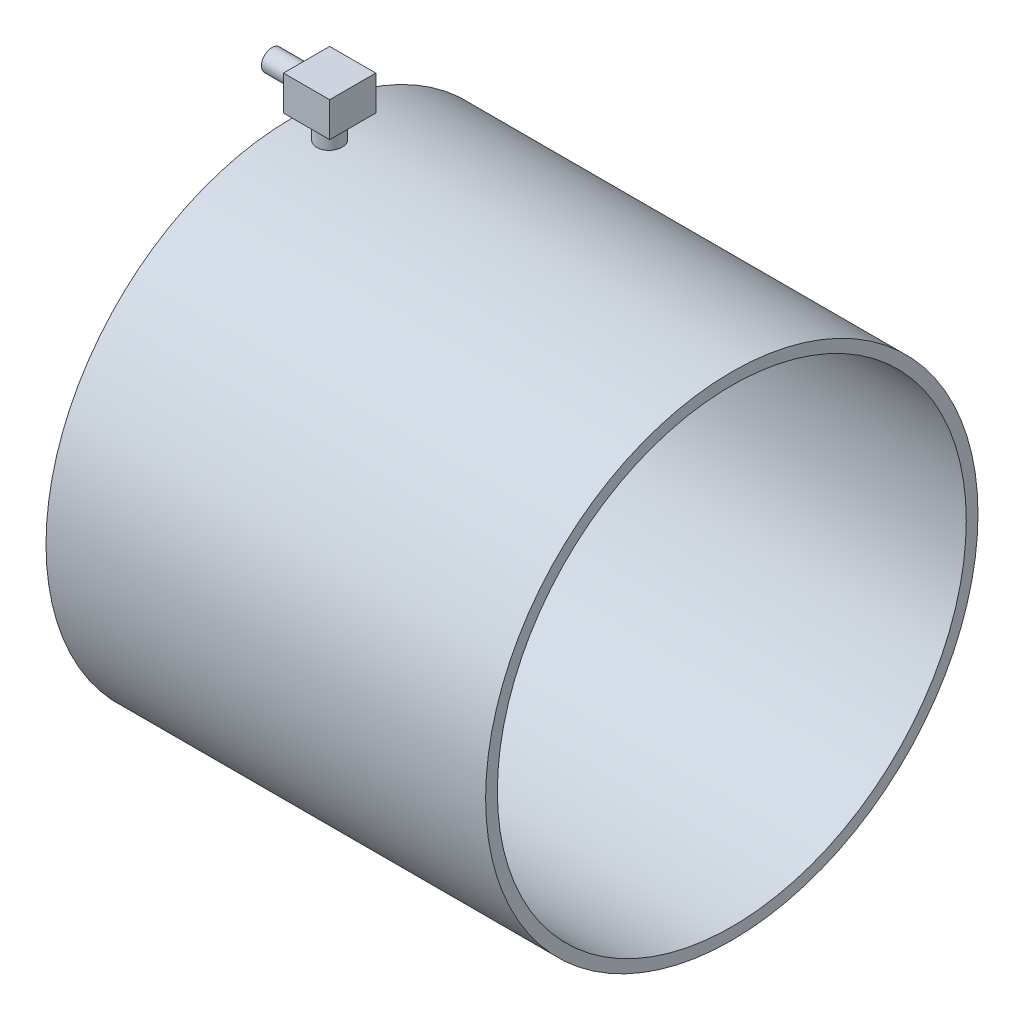
ISO-10303-21;
HEADER;
FILE_DESCRIPTION(('STEP AP214'),'2;1');
FILE_NAME('part.step','',(''),(''),'','','');
FILE_SCHEMA(('AUTOMOTIVE_DESIGN { 1 0 10303 214 1 1 1 1 }'));
ENDSEC;
DATA;
#1=APPLICATION_CONTEXT('core data for automotive mechanical design processes');
#2=APPLICATION_PROTOCOL_DEFINITION('international standard','automotive_design',2000,#1);
#3=PRODUCT_CONTEXT('',#1,'mechanical');
#4=PRODUCT('Part','Part','',(#3));
#5=PRODUCT_RELATED_PRODUCT_CATEGORY('part','',(#4));
#6=PRODUCT_DEFINITION_FORMATION('','',#4);
#7=PRODUCT_DEFINITION_CONTEXT('part definition',#1,'design');
#8=PRODUCT_DEFINITION('design','',#6,#7);
#9=PRODUCT_DEFINITION_SHAPE('','',#8);
#10=(LENGTH_UNIT() NAMED_UNIT(*) SI_UNIT(.MILLI.,.METRE.));
#11=(NAMED_UNIT(*) PLANE_ANGLE_UNIT() SI_UNIT($,.RADIAN.));
#12=(NAMED_UNIT(*) SI_UNIT($,.STERADIAN.) SOLID_ANGLE_UNIT());
#13=UNCERTAINTY_MEASURE_WITH_UNIT(LENGTH_MEASURE(1.E-05),#10,'distance_accuracy_value','');
#14=(GEOMETRIC_REPRESENTATION_CONTEXT(3) GLOBAL_UNCERTAINTY_ASSIGNED_CONTEXT((#13)) GLOBAL_UNIT_ASSIGNED_CONTEXT((#10,
#11,#12)) REPRESENTATION_CONTEXT('',''));
#15=CARTESIAN_POINT('',(0.,0.,0.));
#16=DIRECTION('',(0.,0.,1.));
#17=DIRECTION('',(1.,0.,0.));
#18=AXIS2_PLACEMENT_3D('',#15,#16,#17);
#19=CARTESIAN_POINT('',(3.24493305569254,23.3300961428042,0.));
#20=DIRECTION('',(0.,-1.,0.));
#21=DIRECTION('',(0.,0.,-1.));
#22=AXIS2_PLACEMENT_3D('',#19,#20,#21);
#23=CYLINDRICAL_SURFACE('',#22,1.1044126273876);
#24=CARTESIAN_POINT('',(3.24493305569254,23.3300961428042,0.));
#25=DIRECTION('',(0.,1.,0.));
#26=DIRECTION('',(0.,0.,1.));
#27=AXIS2_PLACEMENT_3D('',#24,#25,#26);
#28=CIRCLE('',#27,1.1044126273876);
#29=CARTESIAN_POINT('',(3.24493305569254,23.3300961428042,1.1044126273876));
#30=VERTEX_POINT('',#29);
#31=EDGE_CURVE('E57',#30,#30,#28,.T.);
#32=ORIENTED_EDGE('',*,*,#31,.F.);
#33=EDGE_LOOP('',(#32));
#34=FACE_BOUND('',#33,.T.);
#35=CARTESIAN_POINT('',(3.24493305569254,20.3300961428042,0.));
#36=DIRECTION('',(0.,1.,0.));
#37=DIRECTION('',(0.,0.,1.));
#38=AXIS2_PLACEMENT_3D('',#35,#36,#37);
#39=CIRCLE('',#38,1.1044126273876);
#40=CARTESIAN_POINT('',(3.24493305569254,20.3300961428042,1.1044126273876));
#41=VERTEX_POINT('',#40);
#42=EDGE_CURVE('E126',#41,#41,#39,.T.);
#43=ORIENTED_EDGE('',*,*,#42,.T.);
#44=EDGE_LOOP('',(#43));
#45=FACE_BOUND('',#44,.T.);
#46=ADVANCED_FACE('F49',(#34,#45),#23,.T.);
#47=CARTESIAN_POINT('',(3.24493305569254,20.3300961428042,0.));
#48=DIRECTION('',(0.,1.,0.));
#49=DIRECTION('',(0.,0.,1.));
#50=AXIS2_PLACEMENT_3D('',#47,#48,#49);
#51=PLANE('',#50);
#52=ORIENTED_EDGE('',*,*,#42,.F.);
#53=EDGE_LOOP('',(#52));
#54=FACE_BOUND('',#53,.T.);
#55=ADVANCED_FACE('F132',(#54),#51,.F.);
#56=CARTESIAN_POINT('',(1.24493305569254,26.3300961428042,-2.));
#57=DIRECTION('',(1.,0.,0.));
#58=DIRECTION('',(0.,0.,-1.));
#59=AXIS2_PLACEMENT_3D('',#56,#57,#58);
#60=PLANE('',#59);
#61=CARTESIAN_POINT('',(1.24493305569254,24.83009614,0.));
#62=DIRECTION('',(1.,0.,0.));
#63=DIRECTION('',(0.,0.,-1.));
#64=AXIS2_PLACEMENT_3D('',#61,#62,#63);
#65=CIRCLE('',#64,0.913347132426428);
#66=CARTESIAN_POINT('',(1.24493305569254,24.83009614,-0.913347132426428));
#67=VERTEX_POINT('',#66);
#68=EDGE_CURVE('E13',#67,#67,#65,.F.);
#69=ORIENTED_EDGE('',*,*,#68,.F.);
#70=EDGE_LOOP('',(#69));
#71=FACE_BOUND('',#70,.T.);
#72=DIRECTION('',(0.,0.,1.));
#73=VECTOR('',#72,1.);
#74=CARTESIAN_POINT('',(1.24493305569254,23.3300961428042,-2.));
#75=LINE('',#74,#73);
#76=CARTESIAN_POINT('',(1.24493305569254,23.3300961428042,-2.));
#77=VERTEX_POINT('',#76);
#78=CARTESIAN_POINT('',(1.24493305569254,23.3300961428042,2.));
#79=VERTEX_POINT('',#78);
#80=EDGE_CURVE('E116',#77,#79,#75,.T.);
#81=ORIENTED_EDGE('',*,*,#80,.T.);
#82=DIRECTION('',(0.,-1.,0.));
#83=VECTOR('',#82,1.);
#84=CARTESIAN_POINT('',(1.24493305569254,26.3300961428042,2.));
#85=LINE('',#84,#83);
#86=CARTESIAN_POINT('',(1.24493305569254,26.3300961428042,2.));
#87=VERTEX_POINT('',#86);
#88=EDGE_CURVE('E107',#87,#79,#85,.T.);
#89=ORIENTED_EDGE('',*,*,#88,.F.);
#90=DIRECTION('',(0.,0.,1.));
#91=VECTOR('',#90,1.);
#92=CARTESIAN_POINT('',(1.24493305569254,26.3300961428042,-2.));
#93=LINE('',#92,#91);
#94=CARTESIAN_POINT('',(1.24493305569254,26.3300961428042,-2.));
#95=VERTEX_POINT('',#94);
#96=EDGE_CURVE('E101',#95,#87,#93,.T.);
#97=ORIENTED_EDGE('',*,*,#96,.F.);
#98=DIRECTION('',(0.,-1.,0.));
#99=VECTOR('',#98,1.);
#100=CARTESIAN_POINT('',(1.24493305569254,26.3300961428042,-2.));
#101=LINE('',#100,#99);
#102=EDGE_CURVE('E112',#95,#77,#101,.T.);
#103=ORIENTED_EDGE('',*,*,#102,.T.);
#104=EDGE_LOOP('',(#81,#89,#97,#103));
#105=FACE_BOUND('',#104,.T.);
#106=ADVANCED_FACE('F134',(#71,#105),#60,.F.);
#107=CARTESIAN_POINT('',(5.24493305569254,26.3300961428042,2.));
#108=DIRECTION('',(0.,0.,-1.));
#109=DIRECTION('',(-1.,0.,0.));
#110=AXIS2_PLACEMENT_3D('',#107,#108,#109);
#111=PLANE('',#110);
#112=DIRECTION('',(1.,0.,0.));
#113=VECTOR('',#112,1.);
#114=CARTESIAN_POINT('',(5.24493305569254,23.3300961428042,2.));
#115=LINE('',#114,#113);
#116=CARTESIAN_POINT('',(5.24493305569254,23.3300961428042,2.));
#117=VERTEX_POINT('',#116);
#118=EDGE_CURVE('E106',#79,#117,#115,.T.);
#119=ORIENTED_EDGE('',*,*,#118,.T.);
#120=DIRECTION('',(0.,-1.,0.));
#121=VECTOR('',#120,1.);
#122=CARTESIAN_POINT('',(5.24493305569254,26.3300961428042,2.));
#123=LINE('',#122,#121);
#124=CARTESIAN_POINT('',(5.24493305569254,26.3300961428042,2.));
#125=VERTEX_POINT('',#124);
#126=EDGE_CURVE('E104',#125,#117,#123,.T.);
#127=ORIENTED_EDGE('',*,*,#126,.F.);
#128=DIRECTION('',(1.,0.,0.));
#129=VECTOR('',#128,1.);
#130=CARTESIAN_POINT('',(5.24493305569254,26.3300961428042,2.));
#131=LINE('',#130,#129);
#132=EDGE_CURVE('E96',#87,#125,#131,.T.);
#133=ORIENTED_EDGE('',*,*,#132,.F.);
#134=ORIENTED_EDGE('',*,*,#88,.T.);
#135=EDGE_LOOP('',(#119,#127,#133,#134));
#136=FACE_BOUND('',#135,.T.);
#137=ADVANCED_FACE('F105',(#136),#111,.F.);
#138=CARTESIAN_POINT('',(5.24493305569254,26.3300961428042,-2.));
#139=DIRECTION('',(-1.,0.,0.));
#140=DIRECTION('',(0.,0.,1.));
#141=AXIS2_PLACEMENT_3D('',#138,#139,#140);
#142=PLANE('',#141);
#143=DIRECTION('',(0.,0.,-1.));
#144=VECTOR('',#143,1.);
#145=CARTESIAN_POINT('',(5.24493305569254,23.3300961428042,-2.));
#146=LINE('',#145,#144);
#147=CARTESIAN_POINT('',(5.24493305569254,23.3300961428042,-2.));
#148=VERTEX_POINT('',#147);
#149=EDGE_CURVE('E82',#117,#148,#146,.T.);
#150=ORIENTED_EDGE('',*,*,#149,.T.);
#151=DIRECTION('',(0.,-1.,0.));
#152=VECTOR('',#151,1.);
#153=CARTESIAN_POINT('',(5.24493305569254,26.3300961428042,-2.));
#154=LINE('',#153,#152);
#155=CARTESIAN_POINT('',(5.24493305569254,26.3300961428042,-2.));
#156=VERTEX_POINT('',#155);
#157=EDGE_CURVE('E108',#156,#148,#154,.T.);
#158=ORIENTED_EDGE('',*,*,#157,.F.);
#159=DIRECTION('',(0.,0.,-1.));
#160=VECTOR('',#159,1.);
#161=CARTESIAN_POINT('',(5.24493305569254,26.3300961428042,-2.));
#162=LINE('',#161,#160);
#163=EDGE_CURVE('E99',#125,#156,#162,.T.);
#164=ORIENTED_EDGE('',*,*,#163,.F.);
#165=ORIENTED_EDGE('',*,*,#126,.T.);
#166=EDGE_LOOP('',(#150,#158,#164,#165));
#167=FACE_BOUND('',#166,.T.);
#168=ADVANCED_FACE('F110',(#167),#142,.F.);
#169=CARTESIAN_POINT('',(5.24493305569254,26.3300961428042,-2.));
#170=DIRECTION('',(0.,0.,1.));
#171=DIRECTION('',(1.,0.,0.));
#172=AXIS2_PLACEMENT_3D('',#169,#170,#171);
#173=PLANE('',#172);
#174=DIRECTION('',(-1.,0.,0.));
#175=VECTOR('',#174,1.);
#176=CARTESIAN_POINT('',(5.24493305569254,23.3300961428042,-2.));
#177=LINE('',#176,#175);
#178=EDGE_CURVE('E88',#148,#77,#177,.T.);
#179=ORIENTED_EDGE('',*,*,#178,.T.);
#180=ORIENTED_EDGE('',*,*,#102,.F.);
#181=DIRECTION('',(-1.,0.,0.));
#182=VECTOR('',#181,1.);
#183=CARTESIAN_POINT('',(5.24493305569254,26.3300961428042,-2.));
#184=LINE('',#183,#182);
#185=EDGE_CURVE('E65',#156,#95,#184,.T.);
#186=ORIENTED_EDGE('',*,*,#185,.F.);
#187=ORIENTED_EDGE('',*,*,#157,.T.);
#188=EDGE_LOOP('',(#179,#180,#186,#187));
#189=FACE_BOUND('',#188,.T.);
#190=ADVANCED_FACE('F148',(#189),#173,.F.);
#191=CARTESIAN_POINT('',(0.,26.3300961428042,0.));
#192=DIRECTION('',(0.,-1.,0.));
#193=DIRECTION('',(0.,0.,-1.));
#194=AXIS2_PLACEMENT_3D('',#191,#192,#193);
#195=PLANE('',#194);
#196=ORIENTED_EDGE('',*,*,#96,.T.);
#197=ORIENTED_EDGE('',*,*,#132,.T.);
#198=ORIENTED_EDGE('',*,*,#163,.T.);
#199=ORIENTED_EDGE('',*,*,#185,.T.);
#200=EDGE_LOOP('',(#196,#197,#198,#199));
#201=FACE_BOUND('',#200,.T.);
#202=ADVANCED_FACE('F97',(#201),#195,.F.);
#203=CARTESIAN_POINT('',(0.,23.3300961428042,0.));
#204=DIRECTION('',(0.,-1.,0.));
#205=DIRECTION('',(0.,0.,-1.));
#206=AXIS2_PLACEMENT_3D('',#203,#204,#205);
#207=PLANE('',#206);
#208=ORIENTED_EDGE('',*,*,#31,.T.);
#209=EDGE_LOOP('',(#208));
#210=FACE_BOUND('',#209,.T.);
#211=ORIENTED_EDGE('',*,*,#80,.F.);
#212=ORIENTED_EDGE('',*,*,#178,.F.);
#213=ORIENTED_EDGE('',*,*,#149,.F.);
#214=ORIENTED_EDGE('',*,*,#118,.F.);
#215=EDGE_LOOP('',(#211,#212,#213,#214));
#216=FACE_BOUND('',#215,.T.);
#217=ADVANCED_FACE('F151',(#210,#216),#207,.T.);
#218=CARTESIAN_POINT('',(-1.75506694430746,24.83009614,0.));
#219=DIRECTION('',(-1.,0.,0.));
#220=DIRECTION('',(0.,0.,1.));
#221=AXIS2_PLACEMENT_3D('',#218,#219,#220);
#222=PLANE('',#221);
#223=CARTESIAN_POINT('',(-1.75506694430746,24.83009614,0.));
#224=DIRECTION('',(-1.,0.,0.));
#225=DIRECTION('',(0.,0.,1.));
#226=AXIS2_PLACEMENT_3D('',#223,#224,#225);
#227=CIRCLE('',#226,0.913347132426428);
#228=CARTESIAN_POINT('',(-1.75506694430746,24.83009614,0.913347132426428));
#229=VERTEX_POINT('',#228);
#230=EDGE_CURVE('E119',#229,#229,#227,.T.);
#231=ORIENTED_EDGE('',*,*,#230,.T.);
#232=EDGE_LOOP('',(#231));
#233=FACE_BOUND('',#232,.T.);
#234=CARTESIAN_POINT('',(-1.75506694430746,24.83009614,0.));
#235=DIRECTION('',(-1.,0.,0.));
#236=DIRECTION('',(0.,0.,1.));
#237=AXIS2_PLACEMENT_3D('',#234,#235,#236);
#238=CIRCLE('',#237,0.661870058374341);
#239=CARTESIAN_POINT('',(-1.75506694430746,24.83009614,0.661870058374342));
#240=VERTEX_POINT('',#239);
#241=EDGE_CURVE('E175',#240,#240,#238,.T.);
#242=ORIENTED_EDGE('',*,*,#241,.F.);
#243=EDGE_LOOP('',(#242));
#244=FACE_BOUND('',#243,.T.);
#245=ADVANCED_FACE('F154',(#233,#244),#222,.T.);
#246=CARTESIAN_POINT('',(-1.75506694430746,24.83009614,0.));
#247=DIRECTION('',(1.,0.,0.));
#248=DIRECTION('',(0.,0.,-1.));
#249=AXIS2_PLACEMENT_3D('',#246,#247,#248);
#250=CYLINDRICAL_SURFACE('',#249,0.913347132426428);
#251=ORIENTED_EDGE('',*,*,#230,.F.);
#252=EDGE_LOOP('',(#251));
#253=FACE_BOUND('',#252,.T.);
#254=ORIENTED_EDGE('',*,*,#68,.T.);
#255=EDGE_LOOP('',(#254));
#256=FACE_BOUND('',#255,.T.);
#257=ADVANCED_FACE('F158',(#253,#256),#250,.T.);
#258=CARTESIAN_POINT('',(-1.75506694430746,24.83009614,0.));
#259=DIRECTION('',(1.,0.,0.));
#260=DIRECTION('',(0.,0.,-1.));
#261=AXIS2_PLACEMENT_3D('',#258,#259,#260);
#262=CYLINDRICAL_SURFACE('',#261,0.661870058374341);
#263=ORIENTED_EDGE('',*,*,#241,.T.);
#264=EDGE_LOOP('',(#263));
#265=FACE_BOUND('',#264,.T.);
#266=CARTESIAN_POINT('',(1.24493305569254,24.83009614,0.));
#267=DIRECTION('',(-1.,0.,0.));
#268=DIRECTION('',(0.,0.,1.));
#269=AXIS2_PLACEMENT_3D('',#266,#267,#268);
#270=CIRCLE('',#269,0.661870058374341);
#271=CARTESIAN_POINT('',(1.24493305569254,24.83009614,0.661870058374341));
#272=VERTEX_POINT('',#271);
#273=EDGE_CURVE('E178',#272,#272,#270,.T.);
#274=ORIENTED_EDGE('',*,*,#273,.F.);
#275=EDGE_LOOP('',(#274));
#276=FACE_BOUND('',#275,.T.);
#277=ADVANCED_FACE('F161',(#265,#276),#262,.F.);
#278=ORIENTED_EDGE('',*,*,#273,.T.);
#279=EDGE_LOOP('',(#278));
#280=FACE_BOUND('',#279,.T.);
#281=ADVANCED_FACE('F141',(#280),#60,.F.);
#282=CLOSED_SHELL('',(#46,#55,#106,#137,#168,#190,#202,#217,#245,#257,#277,#281));
#283=MANIFOLD_SOLID_BREP('B2',#282);
#284=CARTESIAN_POINT('',(38.1,0.,0.));
#285=DIRECTION('',(1.,0.,0.));
#286=DIRECTION('',(0.,0.,-1.));
#287=AXIS2_PLACEMENT_3D('',#284,#285,#286);
#288=PLANE('',#287);
#289=CARTESIAN_POINT('',(38.1,0.,0.));
#290=DIRECTION('',(1.,0.,0.));
#291=DIRECTION('',(0.,0.,-1.));
#292=AXIS2_PLACEMENT_3D('',#289,#290,#291);
#293=CIRCLE('',#292,21.336);
#294=CARTESIAN_POINT('',(38.1,0.,-21.336));
#295=VERTEX_POINT('',#294);
#296=EDGE_CURVE('E48',#295,#295,#293,.T.);
#297=ORIENTED_EDGE('',*,*,#296,.T.);
#298=EDGE_LOOP('',(#297));
#299=FACE_BOUND('',#298,.T.);
#300=CARTESIAN_POINT('',(38.1,0.,0.));
#301=DIRECTION('',(1.,0.,0.));
#302=DIRECTION('',(0.,0.,-1.));
#303=AXIS2_PLACEMENT_3D('',#300,#301,#302);
#304=CIRCLE('',#303,20.32);
#305=CARTESIAN_POINT('',(38.1,0.,-20.32));
#306=VERTEX_POINT('',#305);
#307=EDGE_CURVE('E273',#306,#306,#304,.T.);
#308=ORIENTED_EDGE('',*,*,#307,.F.);
#309=EDGE_LOOP('',(#308));
#310=FACE_BOUND('',#309,.T.);
#311=ADVANCED_FACE('F262',(#299,#310),#288,.T.);
#312=CARTESIAN_POINT('',(0.,0.,0.));
#313=DIRECTION('',(1.,0.,0.));
#314=DIRECTION('',(0.,0.,-1.));
#315=AXIS2_PLACEMENT_3D('',#312,#313,#314);
#316=PLANE('',#315);
#317=CARTESIAN_POINT('',(0.,0.,0.));
#318=DIRECTION('',(1.,0.,0.));
#319=DIRECTION('',(0.,0.,-1.));
#320=AXIS2_PLACEMENT_3D('',#317,#318,#319);
#321=CIRCLE('',#320,21.336);
#322=CARTESIAN_POINT('',(0.,0.,-21.336));
#323=VERTEX_POINT('',#322);
#324=EDGE_CURVE('E266',#323,#323,#321,.T.);
#325=ORIENTED_EDGE('',*,*,#324,.F.);
#326=EDGE_LOOP('',(#325));
#327=FACE_BOUND('',#326,.T.);
#328=CARTESIAN_POINT('',(0.,0.,0.));
#329=DIRECTION('',(1.,0.,0.));
#330=DIRECTION('',(0.,0.,-1.));
#331=AXIS2_PLACEMENT_3D('',#328,#329,#330);
#332=CIRCLE('',#331,20.32);
#333=CARTESIAN_POINT('',(0.,0.,-20.32));
#334=VERTEX_POINT('',#333);
#335=EDGE_CURVE('E275',#334,#334,#332,.T.);
#336=ORIENTED_EDGE('',*,*,#335,.T.);
#337=EDGE_LOOP('',(#336));
#338=FACE_BOUND('',#337,.T.);
#339=ADVANCED_FACE('F285',(#327,#338),#316,.F.);
#340=CARTESIAN_POINT('',(38.1,0.,0.));
#341=DIRECTION('',(-1.,0.,0.));
#342=DIRECTION('',(0.,0.,1.));
#343=AXIS2_PLACEMENT_3D('',#340,#341,#342);
#344=CYLINDRICAL_SURFACE('',#343,21.336);
#345=ORIENTED_EDGE('',*,*,#296,.F.);
#346=EDGE_LOOP('',(#345));
#347=FACE_BOUND('',#346,.T.);
#348=ORIENTED_EDGE('',*,*,#324,.T.);
#349=EDGE_LOOP('',(#348));
#350=FACE_BOUND('',#349,.T.);
#351=ADVANCED_FACE('F264',(#347,#350),#344,.T.);
#352=CARTESIAN_POINT('',(38.1,0.,0.));
#353=DIRECTION('',(-1.,0.,0.));
#354=DIRECTION('',(0.,0.,1.));
#355=AXIS2_PLACEMENT_3D('',#352,#353,#354);
#356=CYLINDRICAL_SURFACE('',#355,20.32);
#357=ORIENTED_EDGE('',*,*,#307,.T.);
#358=EDGE_LOOP('',(#357));
#359=FACE_BOUND('',#358,.T.);
#360=ORIENTED_EDGE('',*,*,#335,.F.);
#361=EDGE_LOOP('',(#360));
#362=FACE_BOUND('',#361,.T.);
#363=ADVANCED_FACE('F281',(#359,#362),#356,.F.);
#364=CLOSED_SHELL('',(#311,#339,#351,#363));
#365=MANIFOLD_SOLID_BREP('B7',#364);
#366=ADVANCED_BREP_SHAPE_REPRESENTATION('',(#18,#283,#365),#14);
#367=SHAPE_DEFINITION_REPRESENTATION(#9,#366);
ENDSEC;
END-ISO-10303-21;
